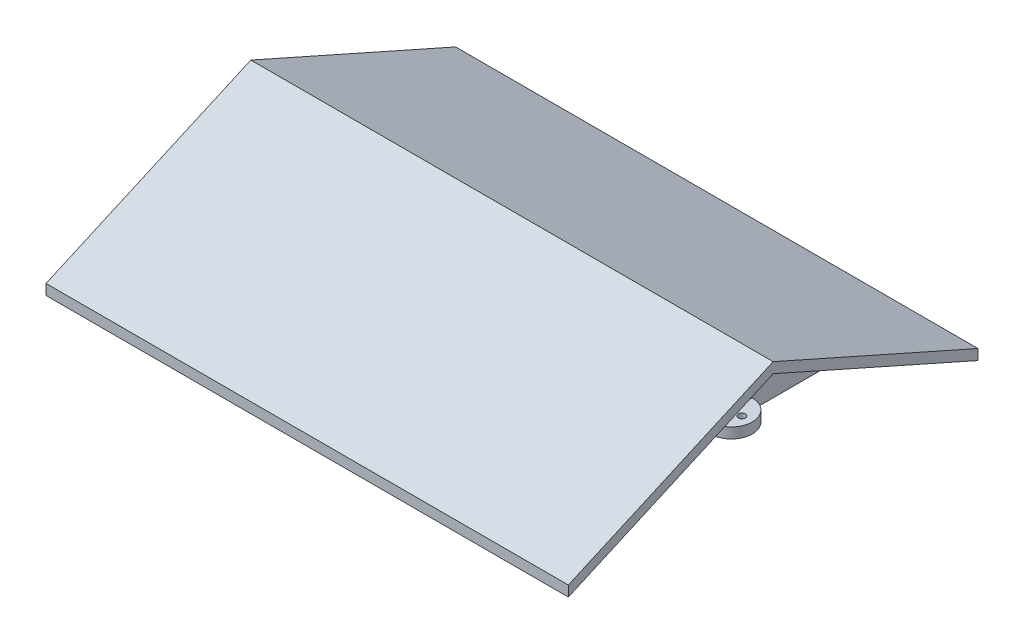
ISO-10303-21;
HEADER;
FILE_DESCRIPTION(('STEP AP214'),'2;1');
FILE_NAME('part.step','',(''),(''),'','','');
FILE_SCHEMA(('AUTOMOTIVE_DESIGN { 1 0 10303 214 1 1 1 1 }'));
ENDSEC;
DATA;
#1=APPLICATION_CONTEXT('core data for automotive mechanical design processes');
#2=APPLICATION_PROTOCOL_DEFINITION('international standard','automotive_design',2000,#1);
#3=PRODUCT_CONTEXT('',#1,'mechanical');
#4=PRODUCT('Part','Part','',(#3));
#5=PRODUCT_RELATED_PRODUCT_CATEGORY('part','',(#4));
#6=PRODUCT_DEFINITION_FORMATION('','',#4);
#7=PRODUCT_DEFINITION_CONTEXT('part definition',#1,'design');
#8=PRODUCT_DEFINITION('design','',#6,#7);
#9=PRODUCT_DEFINITION_SHAPE('','',#8);
#10=(LENGTH_UNIT() NAMED_UNIT(*) SI_UNIT(.MILLI.,.METRE.));
#11=(NAMED_UNIT(*) PLANE_ANGLE_UNIT() SI_UNIT($,.RADIAN.));
#12=(NAMED_UNIT(*) SI_UNIT($,.STERADIAN.) SOLID_ANGLE_UNIT());
#13=UNCERTAINTY_MEASURE_WITH_UNIT(LENGTH_MEASURE(1.E-05),#10,'distance_accuracy_value','');
#14=(GEOMETRIC_REPRESENTATION_CONTEXT(3) GLOBAL_UNCERTAINTY_ASSIGNED_CONTEXT((#13)) GLOBAL_UNIT_ASSIGNED_CONTEXT((#10,
#11,#12)) REPRESENTATION_CONTEXT('',''));
#15=CARTESIAN_POINT('',(0.,0.,0.));
#16=DIRECTION('',(0.,0.,1.));
#17=DIRECTION('',(1.,0.,0.));
#18=AXIS2_PLACEMENT_3D('',#15,#16,#17);
#19=CARTESIAN_POINT('',(-250.,4.17575683731504,1.85589192769557));
#20=DIRECTION('',(0.,-0.913811548620257,-0.406138466053448));
#21=DIRECTION('',(0.,0.406138466053448,-0.913811548620257));
#22=AXIS2_PLACEMENT_3D('',#19,#20,#21);
#23=PLANE('',#22);
#24=DIRECTION('',(0.,0.406138466053448,-0.913811548620257));
#25=VECTOR('',#24,1.);
#26=CARTESIAN_POINT('',(0.,4.17575683731504,1.85589192769557));
#27=LINE('',#26,#25);
#28=CARTESIAN_POINT('',(0.,-8.56595570881448,30.524745156487));
#29=VERTEX_POINT('',#28);
#30=CARTESIAN_POINT('',(0.,35.0005976940686,-67.5));
#31=VERTEX_POINT('',#30);
#32=EDGE_CURVE('E256',#29,#31,#27,.T.);
#33=ORIENTED_EDGE('',*,*,#32,.T.);
#34=DIRECTION('',(1.,0.,0.));
#35=VECTOR('',#34,1.);
#36=CARTESIAN_POINT('',(-250.,35.0005976940686,-67.5));
#37=LINE('',#36,#35);
#38=CARTESIAN_POINT('',(-250.,35.0005976940686,-67.5));
#39=VERTEX_POINT('',#38);
#40=EDGE_CURVE('E301',#39,#31,#37,.T.);
#41=ORIENTED_EDGE('',*,*,#40,.F.);
#42=DIRECTION('',(0.,0.406138466053448,-0.913811548620257));
#43=VECTOR('',#42,1.);
#44=CARTESIAN_POINT('',(-250.,4.17575683731504,1.85589192769557));
#45=LINE('',#44,#43);
#46=CARTESIAN_POINT('',(-250.,-8.56595570881448,30.524745156487));
#47=VERTEX_POINT('',#46);
#48=EDGE_CURVE('E260',#47,#39,#45,.T.);
#49=ORIENTED_EDGE('',*,*,#48,.F.);
#50=DIRECTION('',(1.,0.,0.));
#51=VECTOR('',#50,1.);
#52=CARTESIAN_POINT('',(-250.,-8.56595570881448,30.524745156487));
#53=LINE('',#52,#51);
#54=EDGE_CURVE('E281',#47,#29,#53,.T.);
#55=ORIENTED_EDGE('',*,*,#54,.T.);
#56=EDGE_LOOP('',(#33,#41,#49,#55));
#57=FACE_BOUND('',#56,.T.);
#58=ADVANCED_FACE('F47',(#57),#23,.F.);
#59=CARTESIAN_POINT('',(-250.,54.2788496208202,-24.123933164809));
#60=DIRECTION('',(0.,0.913811548620257,-0.406138466053448));
#61=DIRECTION('',(0.,0.406138466053448,0.913811548620257));
#62=AXIS2_PLACEMENT_3D('',#59,#60,#61);
#63=PLANE('',#62);
#64=DIRECTION('',(0.,0.406138466053448,0.913811548620257));
#65=VECTOR('',#64,1.);
#66=CARTESIAN_POINT('',(0.,54.2788496208202,-24.123933164809));
#67=LINE('',#66,#65);
#68=CARTESIAN_POINT('',(0.,-8.56595570881448,-165.524745156487));
#69=VERTEX_POINT('',#68);
#70=EDGE_CURVE('E264',#69,#31,#67,.T.);
#71=ORIENTED_EDGE('',*,*,#70,.F.);
#72=DIRECTION('',(1.,0.,0.));
#73=VECTOR('',#72,1.);
#74=CARTESIAN_POINT('',(-250.,-8.56595570881448,-165.524745156487));
#75=LINE('',#74,#73);
#76=CARTESIAN_POINT('',(-250.,-8.56595570881448,-165.524745156487));
#77=VERTEX_POINT('',#76);
#78=EDGE_CURVE('E305',#77,#69,#75,.T.);
#79=ORIENTED_EDGE('',*,*,#78,.F.);
#80=DIRECTION('',(0.,0.406138466053448,0.913811548620257));
#81=VECTOR('',#80,1.);
#82=CARTESIAN_POINT('',(-250.,54.2788496208202,-24.123933164809));
#83=LINE('',#82,#81);
#84=EDGE_CURVE('E277',#77,#39,#83,.T.);
#85=ORIENTED_EDGE('',*,*,#84,.T.);
#86=ORIENTED_EDGE('',*,*,#40,.T.);
#87=EDGE_LOOP('',(#71,#79,#85,#86));
#88=FACE_BOUND('',#87,.T.);
#89=ADVANCED_FACE('F462',(#88),#63,.T.);
#90=CARTESIAN_POINT('',(-250.,0.,-165.524745156487));
#91=DIRECTION('',(0.,0.,-1.));
#92=DIRECTION('',(-1.,0.,0.));
#93=AXIS2_PLACEMENT_3D('',#90,#91,#92);
#94=PLANE('',#93);
#95=DIRECTION('',(0.,1.,0.));
#96=VECTOR('',#95,1.);
#97=CARTESIAN_POINT('',(0.,0.,-165.524745156487));
#98=LINE('',#97,#96);
#99=CARTESIAN_POINT('',(0.,-13.5665534028831,-165.524745156487));
#100=VERTEX_POINT('',#99);
#101=EDGE_CURVE('E294',#100,#69,#98,.T.);
#102=ORIENTED_EDGE('',*,*,#101,.F.);
#103=DIRECTION('',(1.,0.,0.));
#104=VECTOR('',#103,1.);
#105=CARTESIAN_POINT('',(-250.,-13.5665534028831,-165.524745156487));
#106=LINE('',#105,#104);
#107=CARTESIAN_POINT('',(-250.,-13.5665534028831,-165.524745156487));
#108=VERTEX_POINT('',#107);
#109=EDGE_CURVE('E308',#108,#100,#106,.T.);
#110=ORIENTED_EDGE('',*,*,#109,.F.);
#111=DIRECTION('',(0.,1.,0.));
#112=VECTOR('',#111,1.);
#113=CARTESIAN_POINT('',(-250.,0.,-165.524745156487));
#114=LINE('',#113,#112);
#115=EDGE_CURVE('E273',#108,#77,#114,.T.);
#116=ORIENTED_EDGE('',*,*,#115,.T.);
#117=ORIENTED_EDGE('',*,*,#78,.T.);
#118=EDGE_LOOP('',(#102,#110,#116,#117));
#119=FACE_BOUND('',#118,.T.);
#120=ADVANCED_FACE('F467',(#119),#94,.T.);
#121=CARTESIAN_POINT('',(-250.,50.1030927835052,-22.2680412371134));
#122=DIRECTION('',(0.,-0.913811548620257,0.406138466053448));
#123=DIRECTION('',(0.,-0.406138466053448,-0.913811548620257));
#124=AXIS2_PLACEMENT_3D('',#121,#122,#123);
#125=PLANE('',#124);
#126=DIRECTION('',(-1.,0.,0.));
#127=VECTOR('',#126,1.);
#128=CARTESIAN_POINT('',(-225.,0.,-135.));
#129=LINE('',#128,#127);
#130=CARTESIAN_POINT('',(-225.,0.,-135.));
#131=VERTEX_POINT('',#130);
#132=CARTESIAN_POINT('',(-230.,0.,-135.));
#133=VERTEX_POINT('',#132);
#134=EDGE_CURVE('E208',#131,#133,#129,.T.);
#135=ORIENTED_EDGE('',*,*,#134,.T.);
#136=DIRECTION('',(0.,-0.406138466053447,-0.913811548620257));
#137=VECTOR('',#136,1.);
#138=CARTESIAN_POINT('',(-230.,30.,-67.5));
#139=LINE('',#138,#137);
#140=CARTESIAN_POINT('',(-230.,30.,-67.5));
#141=VERTEX_POINT('',#140);
#142=EDGE_CURVE('E379',#141,#133,#139,.T.);
#143=ORIENTED_EDGE('',*,*,#142,.F.);
#144=DIRECTION('',(-1.,0.,0.));
#145=VECTOR('',#144,1.);
#146=CARTESIAN_POINT('',(-230.,30.,-67.5));
#147=LINE('',#146,#145);
#148=CARTESIAN_POINT('',(-250.,30.,-67.5));
#149=VERTEX_POINT('',#148);
#150=EDGE_CURVE('E365',#141,#149,#147,.T.);
#151=ORIENTED_EDGE('',*,*,#150,.T.);
#152=DIRECTION('',(0.,-0.406138466053448,-0.913811548620257));
#153=VECTOR('',#152,1.);
#154=CARTESIAN_POINT('',(-250.,50.1030927835052,-22.2680412371134));
#155=LINE('',#154,#153);
#156=EDGE_CURVE('E270',#149,#108,#155,.T.);
#157=ORIENTED_EDGE('',*,*,#156,.T.);
#158=ORIENTED_EDGE('',*,*,#109,.T.);
#159=DIRECTION('',(0.,-0.406138466053448,-0.913811548620257));
#160=VECTOR('',#159,1.);
#161=CARTESIAN_POINT('',(0.,50.1030927835052,-22.2680412371134));
#162=LINE('',#161,#160);
#163=CARTESIAN_POINT('',(0.,30.,-67.5));
#164=VERTEX_POINT('',#163);
#165=EDGE_CURVE('E291',#164,#100,#162,.T.);
#166=ORIENTED_EDGE('',*,*,#165,.F.);
#167=DIRECTION('',(1.,0.,0.));
#168=VECTOR('',#167,1.);
#169=CARTESIAN_POINT('',(-20.,30.,-67.5));
#170=LINE('',#169,#168);
#171=CARTESIAN_POINT('',(-20.,30.,-67.5));
#172=VERTEX_POINT('',#171);
#173=EDGE_CURVE('E234',#172,#164,#170,.T.);
#174=ORIENTED_EDGE('',*,*,#173,.F.);
#175=DIRECTION('',(0.,0.406138466053447,0.913811548620257));
#176=VECTOR('',#175,1.);
#177=CARTESIAN_POINT('',(-20.,0.,-135.));
#178=LINE('',#177,#176);
#179=CARTESIAN_POINT('',(-20.,0.,-135.));
#180=VERTEX_POINT('',#179);
#181=EDGE_CURVE('E230',#180,#172,#178,.T.);
#182=ORIENTED_EDGE('',*,*,#181,.F.);
#183=DIRECTION('',(1.,0.,0.));
#184=VECTOR('',#183,1.);
#185=CARTESIAN_POINT('',(-25.,0.,-135.));
#186=LINE('',#185,#184);
#187=CARTESIAN_POINT('',(-25.,0.,-135.));
#188=VERTEX_POINT('',#187);
#189=EDGE_CURVE('E252',#188,#180,#186,.T.);
#190=ORIENTED_EDGE('',*,*,#189,.F.);
#191=DIRECTION('',(0.,0.406138466053448,0.913811548620257));
#192=VECTOR('',#191,1.);
#193=CARTESIAN_POINT('',(-25.,0.,-135.));
#194=LINE('',#193,#192);
#195=CARTESIAN_POINT('',(-25.,30.,-67.5));
#196=VERTEX_POINT('',#195);
#197=EDGE_CURVE('E247',#188,#196,#194,.T.);
#198=ORIENTED_EDGE('',*,*,#197,.T.);
#199=DIRECTION('',(1.,0.,0.));
#200=VECTOR('',#199,1.);
#201=CARTESIAN_POINT('',(-250.,30.,-67.5));
#202=LINE('',#201,#200);
#203=CARTESIAN_POINT('',(-225.,30.,-67.5));
#204=VERTEX_POINT('',#203);
#205=EDGE_CURVE('E312',#204,#196,#202,.T.);
#206=ORIENTED_EDGE('',*,*,#205,.F.);
#207=DIRECTION('',(0.,-0.406138466053448,-0.913811548620257));
#208=VECTOR('',#207,1.);
#209=CARTESIAN_POINT('',(-225.,0.,-135.));
#210=LINE('',#209,#208);
#211=EDGE_CURVE('E216',#204,#131,#210,.T.);
#212=ORIENTED_EDGE('',*,*,#211,.T.);
#213=EDGE_LOOP('',(#135,#143,#151,#157,#158,#166,#174,#182,#190,#198,#206,#212));
#214=FACE_BOUND('',#213,.T.);
#215=ADVANCED_FACE('F346',(#214),#125,.T.);
#216=CARTESIAN_POINT('',(-250.,0.,0.));
#217=DIRECTION('',(0.,0.913811548620257,0.406138466053447));
#218=DIRECTION('',(0.,-0.406138466053447,0.913811548620257));
#219=AXIS2_PLACEMENT_3D('',#216,#217,#218);
#220=PLANE('',#219);
#221=DIRECTION('',(0.,-0.406138466053447,0.913811548620257));
#222=VECTOR('',#221,1.);
#223=CARTESIAN_POINT('',(-250.,0.,0.));
#224=LINE('',#223,#222);
#225=CARTESIAN_POINT('',(-250.,-13.5665534028831,30.524745156487));
#226=VERTEX_POINT('',#225);
#227=EDGE_CURVE('E267',#149,#226,#224,.T.);
#228=ORIENTED_EDGE('',*,*,#227,.F.);
#229=ORIENTED_EDGE('',*,*,#150,.F.);
#230=DIRECTION('',(0.,0.406138466053447,-0.913811548620257));
#231=VECTOR('',#230,1.);
#232=CARTESIAN_POINT('',(-230.,0.,0.));
#233=LINE('',#232,#231);
#234=CARTESIAN_POINT('',(-230.,0.,0.));
#235=VERTEX_POINT('',#234);
#236=EDGE_CURVE('E369',#235,#141,#233,.T.);
#237=ORIENTED_EDGE('',*,*,#236,.F.);
#238=DIRECTION('',(-1.,0.,0.));
#239=VECTOR('',#238,1.);
#240=CARTESIAN_POINT('',(-225.,0.,0.));
#241=LINE('',#240,#239);
#242=CARTESIAN_POINT('',(-225.,0.,0.));
#243=VERTEX_POINT('',#242);
#244=EDGE_CURVE('E214',#243,#235,#241,.T.);
#245=ORIENTED_EDGE('',*,*,#244,.F.);
#246=DIRECTION('',(0.,0.406138466053448,-0.913811548620257));
#247=VECTOR('',#246,1.);
#248=CARTESIAN_POINT('',(-225.,30.,-67.5));
#249=LINE('',#248,#247);
#250=EDGE_CURVE('E362',#243,#204,#249,.T.);
#251=ORIENTED_EDGE('',*,*,#250,.T.);
#252=ORIENTED_EDGE('',*,*,#205,.T.);
#253=DIRECTION('',(0.,-0.406138466053448,0.913811548620257));
#254=VECTOR('',#253,1.);
#255=CARTESIAN_POINT('',(-25.,30.,-67.5));
#256=LINE('',#255,#254);
#257=CARTESIAN_POINT('',(-25.,0.,0.));
#258=VERTEX_POINT('',#257);
#259=EDGE_CURVE('E238',#196,#258,#256,.T.);
#260=ORIENTED_EDGE('',*,*,#259,.T.);
#261=DIRECTION('',(1.,0.,0.));
#262=VECTOR('',#261,1.);
#263=CARTESIAN_POINT('',(-25.,0.,0.));
#264=LINE('',#263,#262);
#265=CARTESIAN_POINT('',(-20.,0.,0.));
#266=VERTEX_POINT('',#265);
#267=EDGE_CURVE('E251',#258,#266,#264,.T.);
#268=ORIENTED_EDGE('',*,*,#267,.T.);
#269=DIRECTION('',(0.,-0.406138466053447,0.913811548620257));
#270=VECTOR('',#269,1.);
#271=CARTESIAN_POINT('',(-20.,30.,-67.5));
#272=LINE('',#271,#270);
#273=EDGE_CURVE('E222',#172,#266,#272,.T.);
#274=ORIENTED_EDGE('',*,*,#273,.F.);
#275=ORIENTED_EDGE('',*,*,#173,.T.);
#276=DIRECTION('',(0.,-0.406138466053447,0.913811548620257));
#277=VECTOR('',#276,1.);
#278=CARTESIAN_POINT('',(0.,0.,0.));
#279=LINE('',#278,#277);
#280=CARTESIAN_POINT('',(0.,-13.5665534028831,30.524745156487));
#281=VERTEX_POINT('',#280);
#282=EDGE_CURVE('E288',#164,#281,#279,.T.);
#283=ORIENTED_EDGE('',*,*,#282,.T.);
#284=DIRECTION('',(1.,0.,0.));
#285=VECTOR('',#284,1.);
#286=CARTESIAN_POINT('',(-250.,-13.5665534028831,30.524745156487));
#287=LINE('',#286,#285);
#288=EDGE_CURVE('E315',#226,#281,#287,.T.);
#289=ORIENTED_EDGE('',*,*,#288,.F.);
#290=EDGE_LOOP('',(#228,#229,#237,#245,#251,#252,#260,#268,#274,#275,#283,#289));
#291=FACE_BOUND('',#290,.T.);
#292=ADVANCED_FACE('F430',(#291),#220,.F.);
#293=CARTESIAN_POINT('',(-250.,0.,30.524745156487));
#294=DIRECTION('',(0.,0.,-1.));
#295=DIRECTION('',(-1.,0.,0.));
#296=AXIS2_PLACEMENT_3D('',#293,#294,#295);
#297=PLANE('',#296);
#298=DIRECTION('',(0.,1.,0.));
#299=VECTOR('',#298,1.);
#300=CARTESIAN_POINT('',(0.,0.,30.524745156487));
#301=LINE('',#300,#299);
#302=EDGE_CURVE('E285',#281,#29,#301,.T.);
#303=ORIENTED_EDGE('',*,*,#302,.T.);
#304=ORIENTED_EDGE('',*,*,#54,.F.);
#305=DIRECTION('',(0.,1.,0.));
#306=VECTOR('',#305,1.);
#307=CARTESIAN_POINT('',(-250.,0.,30.524745156487));
#308=LINE('',#307,#306);
#309=EDGE_CURVE('E263',#226,#47,#308,.T.);
#310=ORIENTED_EDGE('',*,*,#309,.F.);
#311=ORIENTED_EDGE('',*,*,#288,.T.);
#312=EDGE_LOOP('',(#303,#304,#310,#311));
#313=FACE_BOUND('',#312,.T.);
#314=ADVANCED_FACE('F486',(#313),#297,.F.);
#315=CARTESIAN_POINT('',(-250.,0.,0.));
#316=DIRECTION('',(1.,0.,0.));
#317=DIRECTION('',(0.,0.,-1.));
#318=AXIS2_PLACEMENT_3D('',#315,#316,#317);
#319=PLANE('',#318);
#320=ORIENTED_EDGE('',*,*,#156,.F.);
#321=ORIENTED_EDGE('',*,*,#227,.T.);
#322=ORIENTED_EDGE('',*,*,#309,.T.);
#323=ORIENTED_EDGE('',*,*,#48,.T.);
#324=ORIENTED_EDGE('',*,*,#84,.F.);
#325=ORIENTED_EDGE('',*,*,#115,.F.);
#326=EDGE_LOOP('',(#320,#321,#322,#323,#324,#325));
#327=FACE_BOUND('',#326,.T.);
#328=ADVANCED_FACE('F482',(#327),#319,.F.);
#329=CARTESIAN_POINT('',(0.,0.,0.));
#330=DIRECTION('',(1.,0.,0.));
#331=DIRECTION('',(0.,0.,-1.));
#332=AXIS2_PLACEMENT_3D('',#329,#330,#331);
#333=PLANE('',#332);
#334=ORIENTED_EDGE('',*,*,#282,.F.);
#335=ORIENTED_EDGE('',*,*,#165,.T.);
#336=ORIENTED_EDGE('',*,*,#101,.T.);
#337=ORIENTED_EDGE('',*,*,#70,.T.);
#338=ORIENTED_EDGE('',*,*,#32,.F.);
#339=ORIENTED_EDGE('',*,*,#302,.F.);
#340=EDGE_LOOP('',(#334,#335,#336,#337,#338,#339));
#341=FACE_BOUND('',#340,.T.);
#342=ADVANCED_FACE('F477',(#341),#333,.T.);
#343=CARTESIAN_POINT('',(-25.,0.,0.));
#344=DIRECTION('',(0.,-1.,0.));
#345=DIRECTION('',(0.,0.,-1.));
#346=AXIS2_PLACEMENT_3D('',#343,#344,#345);
#347=PLANE('',#346);
#348=DIRECTION('',(0.,0.,-1.));
#349=VECTOR('',#348,1.);
#350=CARTESIAN_POINT('',(-20.,0.,0.));
#351=LINE('',#350,#349);
#352=CARTESIAN_POINT('',(-20.,0.,-77.5));
#353=VERTEX_POINT('',#352);
#354=EDGE_CURVE('E226',#353,#180,#351,.T.);
#355=ORIENTED_EDGE('',*,*,#354,.F.);
#356=CARTESIAN_POINT('',(-20.,0.,-67.5));
#357=DIRECTION('',(0.,-1.,0.));
#358=DIRECTION('',(0.,0.,-1.));
#359=AXIS2_PLACEMENT_3D('',#356,#357,#358);
#360=CIRCLE('',#359,10.);
#361=CARTESIAN_POINT('',(-20.,0.,-57.5));
#362=VERTEX_POINT('',#361);
#363=EDGE_CURVE('E398',#353,#362,#360,.T.);
#364=ORIENTED_EDGE('',*,*,#363,.T.);
#365=EDGE_CURVE('E227',#266,#362,#351,.T.);
#366=ORIENTED_EDGE('',*,*,#365,.F.);
#367=ORIENTED_EDGE('',*,*,#267,.F.);
#368=DIRECTION('',(0.,0.,-1.));
#369=VECTOR('',#368,1.);
#370=CARTESIAN_POINT('',(-25.,0.,0.));
#371=LINE('',#370,#369);
#372=CARTESIAN_POINT('',(-25.,0.,-58.8397459621556));
#373=VERTEX_POINT('',#372);
#374=EDGE_CURVE('E243',#258,#373,#371,.T.);
#375=ORIENTED_EDGE('',*,*,#374,.T.);
#376=CARTESIAN_POINT('',(-25.,0.,-76.1602540378444));
#377=VERTEX_POINT('',#376);
#378=EDGE_CURVE('E201',#373,#377,#360,.T.);
#379=ORIENTED_EDGE('',*,*,#378,.T.);
#380=EDGE_CURVE('E242',#377,#188,#371,.T.);
#381=ORIENTED_EDGE('',*,*,#380,.T.);
#382=ORIENTED_EDGE('',*,*,#189,.T.);
#383=EDGE_LOOP('',(#355,#364,#366,#367,#375,#379,#381,#382));
#384=FACE_BOUND('',#383,.T.);
#385=CARTESIAN_POINT('',(-15.,0.,-67.5));
#386=DIRECTION('',(0.,-1.,0.));
#387=DIRECTION('',(0.,0.,-1.));
#388=AXIS2_PLACEMENT_3D('',#385,#386,#387);
#389=CIRCLE('',#388,1.7);
#390=CARTESIAN_POINT('',(-15.,0.,-69.2));
#391=VERTEX_POINT('',#390);
#392=EDGE_CURVE('E393',#391,#391,#389,.T.);
#393=ORIENTED_EDGE('',*,*,#392,.F.);
#394=EDGE_LOOP('',(#393));
#395=FACE_BOUND('',#394,.T.);
#396=ADVANCED_FACE('F349',(#384,#395),#347,.T.);
#397=CARTESIAN_POINT('',(-25.,0.,0.));
#398=DIRECTION('',(-1.,0.,0.));
#399=DIRECTION('',(0.,0.,1.));
#400=AXIS2_PLACEMENT_3D('',#397,#398,#399);
#401=PLANE('',#400);
#402=DIRECTION('',(0.,-1.,0.));
#403=VECTOR('',#402,1.);
#404=CARTESIAN_POINT('',(-25.,5.,-76.1602540378444));
#405=LINE('',#404,#403);
#406=CARTESIAN_POINT('',(-25.,5.,-76.1602540378444));
#407=VERTEX_POINT('',#406);
#408=EDGE_CURVE('E382',#407,#377,#405,.T.);
#409=ORIENTED_EDGE('',*,*,#408,.F.);
#410=DIRECTION('',(0.,0.,1.));
#411=VECTOR('',#410,1.);
#412=CARTESIAN_POINT('',(-25.,5.,0.));
#413=LINE('',#412,#411);
#414=CARTESIAN_POINT('',(-25.,5.,-58.8397459621556));
#415=VERTEX_POINT('',#414);
#416=EDGE_CURVE('E388',#407,#415,#413,.T.);
#417=ORIENTED_EDGE('',*,*,#416,.T.);
#418=DIRECTION('',(0.,-1.,0.));
#419=VECTOR('',#418,1.);
#420=CARTESIAN_POINT('',(-25.,5.,-58.8397459621556));
#421=LINE('',#420,#419);
#422=EDGE_CURVE('E385',#373,#415,#421,.F.);
#423=ORIENTED_EDGE('',*,*,#422,.F.);
#424=ORIENTED_EDGE('',*,*,#374,.F.);
#425=ORIENTED_EDGE('',*,*,#259,.F.);
#426=ORIENTED_EDGE('',*,*,#197,.F.);
#427=ORIENTED_EDGE('',*,*,#380,.F.);
#428=EDGE_LOOP('',(#409,#417,#423,#424,#425,#426,#427));
#429=FACE_BOUND('',#428,.T.);
#430=ADVANCED_FACE('F357',(#429),#401,.T.);
#431=CARTESIAN_POINT('',(-20.,0.,0.));
#432=DIRECTION('',(-1.,0.,0.));
#433=DIRECTION('',(0.,0.,1.));
#434=AXIS2_PLACEMENT_3D('',#431,#432,#433);
#435=PLANE('',#434);
#436=DIRECTION('',(0.,0.,1.));
#437=VECTOR('',#436,1.);
#438=CARTESIAN_POINT('',(-20.,5.,0.));
#439=LINE('',#438,#437);
#440=CARTESIAN_POINT('',(-20.,5.,-77.5));
#441=VERTEX_POINT('',#440);
#442=CARTESIAN_POINT('',(-20.,5.,-57.5));
#443=VERTEX_POINT('',#442);
#444=EDGE_CURVE('E304',#441,#443,#439,.T.);
#445=ORIENTED_EDGE('',*,*,#444,.F.);
#446=DIRECTION('',(0.,-1.,0.));
#447=VECTOR('',#446,1.);
#448=CARTESIAN_POINT('',(-20.,5.,-77.5));
#449=LINE('',#448,#447);
#450=EDGE_CURVE('E328',#441,#353,#449,.T.);
#451=ORIENTED_EDGE('',*,*,#450,.T.);
#452=ORIENTED_EDGE('',*,*,#354,.T.);
#453=ORIENTED_EDGE('',*,*,#181,.T.);
#454=ORIENTED_EDGE('',*,*,#273,.T.);
#455=ORIENTED_EDGE('',*,*,#365,.T.);
#456=DIRECTION('',(0.,-1.,0.));
#457=VECTOR('',#456,1.);
#458=CARTESIAN_POINT('',(-20.,5.,-57.5));
#459=LINE('',#458,#457);
#460=EDGE_CURVE('E325',#362,#443,#459,.F.);
#461=ORIENTED_EDGE('',*,*,#460,.T.);
#462=EDGE_LOOP('',(#445,#451,#452,#453,#454,#455,#461));
#463=FACE_BOUND('',#462,.T.);
#464=ADVANCED_FACE('F339',(#463),#435,.F.);
#465=CARTESIAN_POINT('',(-225.,0.,0.));
#466=DIRECTION('',(0.,-1.,0.));
#467=DIRECTION('',(0.,0.,-1.));
#468=AXIS2_PLACEMENT_3D('',#465,#466,#467);
#469=PLANE('',#468);
#470=DIRECTION('',(0.,0.,1.));
#471=VECTOR('',#470,1.);
#472=CARTESIAN_POINT('',(-230.,0.,-135.));
#473=LINE('',#472,#471);
#474=CARTESIAN_POINT('',(-230.,0.,-57.5));
#475=VERTEX_POINT('',#474);
#476=EDGE_CURVE('E378',#475,#235,#473,.T.);
#477=ORIENTED_EDGE('',*,*,#476,.F.);
#478=CARTESIAN_POINT('',(-230.,0.,-67.5));
#479=DIRECTION('',(0.,-1.,0.));
#480=DIRECTION('',(0.,0.,-1.));
#481=AXIS2_PLACEMENT_3D('',#478,#479,#480);
#482=CIRCLE('',#481,10.);
#483=CARTESIAN_POINT('',(-230.,0.,-77.5));
#484=VERTEX_POINT('',#483);
#485=EDGE_CURVE('E191',#475,#484,#482,.T.);
#486=ORIENTED_EDGE('',*,*,#485,.T.);
#487=EDGE_CURVE('E375',#133,#484,#473,.T.);
#488=ORIENTED_EDGE('',*,*,#487,.F.);
#489=ORIENTED_EDGE('',*,*,#134,.F.);
#490=DIRECTION('',(0.,0.,1.));
#491=VECTOR('',#490,1.);
#492=CARTESIAN_POINT('',(-225.,0.,0.));
#493=LINE('',#492,#491);
#494=CARTESIAN_POINT('',(-225.,0.,-76.1602540378444));
#495=VERTEX_POINT('',#494);
#496=EDGE_CURVE('E198',#131,#495,#493,.T.);
#497=ORIENTED_EDGE('',*,*,#496,.T.);
#498=CARTESIAN_POINT('',(-225.,0.,-58.8397459621556));
#499=VERTEX_POINT('',#498);
#500=EDGE_CURVE('E62',#495,#499,#482,.T.);
#501=ORIENTED_EDGE('',*,*,#500,.T.);
#502=EDGE_CURVE('E210',#499,#243,#493,.T.);
#503=ORIENTED_EDGE('',*,*,#502,.T.);
#504=ORIENTED_EDGE('',*,*,#244,.T.);
#505=EDGE_LOOP('',(#477,#486,#488,#489,#497,#501,#503,#504));
#506=FACE_BOUND('',#505,.T.);
#507=CARTESIAN_POINT('',(-235.,0.,-67.5));
#508=DIRECTION('',(0.,-1.,0.));
#509=DIRECTION('',(0.,0.,-1.));
#510=AXIS2_PLACEMENT_3D('',#507,#508,#509);
#511=CIRCLE('',#510,1.70000000000001);
#512=CARTESIAN_POINT('',(-235.,0.,-69.2));
#513=VERTEX_POINT('',#512);
#514=EDGE_CURVE('E412',#513,#513,#511,.T.);
#515=ORIENTED_EDGE('',*,*,#514,.F.);
#516=EDGE_LOOP('',(#515));
#517=FACE_BOUND('',#516,.T.);
#518=ADVANCED_FACE('F204',(#506,#517),#469,.T.);
#519=CARTESIAN_POINT('',(-225.,0.,0.));
#520=DIRECTION('',(-1.,0.,0.));
#521=DIRECTION('',(0.,0.,1.));
#522=AXIS2_PLACEMENT_3D('',#519,#520,#521);
#523=PLANE('',#522);
#524=DIRECTION('',(0.,0.,1.));
#525=VECTOR('',#524,1.);
#526=CARTESIAN_POINT('',(-225.,5.,0.));
#527=LINE('',#526,#525);
#528=CARTESIAN_POINT('',(-225.,5.,-76.1602540378444));
#529=VERTEX_POINT('',#528);
#530=CARTESIAN_POINT('',(-225.,5.,-58.8397459621556));
#531=VERTEX_POINT('',#530);
#532=EDGE_CURVE('E199',#529,#531,#527,.T.);
#533=ORIENTED_EDGE('',*,*,#532,.F.);
#534=DIRECTION('',(0.,-1.,0.));
#535=VECTOR('',#534,1.);
#536=CARTESIAN_POINT('',(-225.,5.,-76.1602540378444));
#537=LINE('',#536,#535);
#538=EDGE_CURVE('E184',#529,#495,#537,.T.);
#539=ORIENTED_EDGE('',*,*,#538,.T.);
#540=ORIENTED_EDGE('',*,*,#496,.F.);
#541=ORIENTED_EDGE('',*,*,#211,.F.);
#542=ORIENTED_EDGE('',*,*,#250,.F.);
#543=ORIENTED_EDGE('',*,*,#502,.F.);
#544=DIRECTION('',(0.,-1.,0.));
#545=VECTOR('',#544,1.);
#546=CARTESIAN_POINT('',(-225.,5.,-58.8397459621556));
#547=LINE('',#546,#545);
#548=EDGE_CURVE('E187',#499,#531,#547,.F.);
#549=ORIENTED_EDGE('',*,*,#548,.T.);
#550=EDGE_LOOP('',(#533,#539,#540,#541,#542,#543,#549));
#551=FACE_BOUND('',#550,.T.);
#552=ADVANCED_FACE('F196',(#551),#523,.F.);
#553=CARTESIAN_POINT('',(-230.,0.,0.));
#554=DIRECTION('',(1.,0.,0.));
#555=DIRECTION('',(0.,0.,-1.));
#556=AXIS2_PLACEMENT_3D('',#553,#554,#555);
#557=PLANE('',#556);
#558=DIRECTION('',(0.,0.,-1.));
#559=VECTOR('',#558,1.);
#560=CARTESIAN_POINT('',(-230.,5.,0.));
#561=LINE('',#560,#559);
#562=CARTESIAN_POINT('',(-230.,5.,-57.5));
#563=VERTEX_POINT('',#562);
#564=CARTESIAN_POINT('',(-230.,5.,-77.5));
#565=VERTEX_POINT('',#564);
#566=EDGE_CURVE('E332',#563,#565,#561,.T.);
#567=ORIENTED_EDGE('',*,*,#566,.F.);
#568=DIRECTION('',(0.,-1.,0.));
#569=VECTOR('',#568,1.);
#570=CARTESIAN_POINT('',(-230.,5.,-57.5));
#571=LINE('',#570,#569);
#572=EDGE_CURVE('E12',#563,#475,#571,.T.);
#573=ORIENTED_EDGE('',*,*,#572,.T.);
#574=ORIENTED_EDGE('',*,*,#476,.T.);
#575=ORIENTED_EDGE('',*,*,#236,.T.);
#576=ORIENTED_EDGE('',*,*,#142,.T.);
#577=ORIENTED_EDGE('',*,*,#487,.T.);
#578=DIRECTION('',(0.,-1.,0.));
#579=VECTOR('',#578,1.);
#580=CARTESIAN_POINT('',(-230.,5.,-77.5));
#581=LINE('',#580,#579);
#582=EDGE_CURVE('E55',#484,#565,#581,.F.);
#583=ORIENTED_EDGE('',*,*,#582,.T.);
#584=EDGE_LOOP('',(#567,#573,#574,#575,#576,#577,#583));
#585=FACE_BOUND('',#584,.T.);
#586=ADVANCED_FACE('F432',(#585),#557,.F.);
#587=CARTESIAN_POINT('',(-15.,5.,-67.5));
#588=DIRECTION('',(0.,-1.,0.));
#589=DIRECTION('',(0.,0.,-1.));
#590=AXIS2_PLACEMENT_3D('',#587,#588,#589);
#591=CYLINDRICAL_SURFACE('',#590,1.7);
#592=CARTESIAN_POINT('',(-15.,5.,-67.5));
#593=DIRECTION('',(0.,-1.,0.));
#594=DIRECTION('',(0.,0.,-1.));
#595=AXIS2_PLACEMENT_3D('',#592,#593,#594);
#596=CIRCLE('',#595,1.7);
#597=CARTESIAN_POINT('',(-15.,5.,-69.2));
#598=VERTEX_POINT('',#597);
#599=EDGE_CURVE('E392',#598,#598,#596,.T.);
#600=ORIENTED_EDGE('',*,*,#599,.F.);
#601=EDGE_LOOP('',(#600));
#602=FACE_BOUND('',#601,.T.);
#603=ORIENTED_EDGE('',*,*,#392,.T.);
#604=EDGE_LOOP('',(#603));
#605=FACE_BOUND('',#604,.T.);
#606=ADVANCED_FACE('F459',(#602,#605),#591,.F.);
#607=CARTESIAN_POINT('',(0.,5.,0.));
#608=DIRECTION('',(0.,-1.,0.));
#609=DIRECTION('',(0.,0.,-1.));
#610=AXIS2_PLACEMENT_3D('',#607,#608,#609);
#611=PLANE('',#610);
#612=ORIENTED_EDGE('',*,*,#599,.T.);
#613=EDGE_LOOP('',(#612));
#614=FACE_BOUND('',#613,.T.);
#615=CARTESIAN_POINT('',(-20.,5.,-67.5));
#616=DIRECTION('',(0.,-1.,0.));
#617=DIRECTION('',(0.,0.,-1.));
#618=AXIS2_PLACEMENT_3D('',#615,#616,#617);
#619=CIRCLE('',#618,10.);
#620=EDGE_CURVE('E404',#441,#443,#619,.T.);
#621=ORIENTED_EDGE('',*,*,#620,.F.);
#622=ORIENTED_EDGE('',*,*,#444,.T.);
#623=EDGE_LOOP('',(#621,#622));
#624=FACE_BOUND('',#623,.T.);
#625=ADVANCED_FACE('F447',(#614,#624),#611,.F.);
#626=CARTESIAN_POINT('',(-20.,5.,-67.5));
#627=DIRECTION('',(0.,-1.,0.));
#628=DIRECTION('',(0.,0.,-1.));
#629=AXIS2_PLACEMENT_3D('',#626,#627,#628);
#630=CYLINDRICAL_SURFACE('',#629,10.);
#631=ORIENTED_EDGE('',*,*,#450,.F.);
#632=ORIENTED_EDGE('',*,*,#620,.T.);
#633=ORIENTED_EDGE('',*,*,#460,.F.);
#634=ORIENTED_EDGE('',*,*,#363,.F.);
#635=EDGE_LOOP('',(#631,#632,#633,#634));
#636=FACE_BOUND('',#635,.T.);
#637=ADVANCED_FACE('F455',(#636),#630,.T.);
#638=EDGE_CURVE('E397',#415,#407,#619,.T.);
#639=ORIENTED_EDGE('',*,*,#638,.T.);
#640=ORIENTED_EDGE('',*,*,#408,.T.);
#641=ORIENTED_EDGE('',*,*,#378,.F.);
#642=ORIENTED_EDGE('',*,*,#422,.T.);
#643=EDGE_LOOP('',(#639,#640,#641,#642));
#644=FACE_BOUND('',#643,.T.);
#645=ADVANCED_FACE('F440',(#644),#630,.T.);
#646=ORIENTED_EDGE('',*,*,#416,.F.);
#647=ORIENTED_EDGE('',*,*,#638,.F.);
#648=EDGE_LOOP('',(#646,#647));
#649=FACE_BOUND('',#648,.T.);
#650=ADVANCED_FACE('F443',(#649),#611,.F.);
#651=CARTESIAN_POINT('',(-235.,5.,-67.5));
#652=DIRECTION('',(0.,-1.,0.));
#653=DIRECTION('',(0.,0.,-1.));
#654=AXIS2_PLACEMENT_3D('',#651,#652,#653);
#655=CYLINDRICAL_SURFACE('',#654,1.70000000000001);
#656=CARTESIAN_POINT('',(-235.,5.,-67.5));
#657=DIRECTION('',(0.,-1.,0.));
#658=DIRECTION('',(0.,0.,-1.));
#659=AXIS2_PLACEMENT_3D('',#656,#657,#658);
#660=CIRCLE('',#659,1.70000000000001);
#661=CARTESIAN_POINT('',(-235.,5.,-69.2));
#662=VERTEX_POINT('',#661);
#663=EDGE_CURVE('E190',#662,#662,#660,.T.);
#664=ORIENTED_EDGE('',*,*,#663,.F.);
#665=EDGE_LOOP('',(#664));
#666=FACE_BOUND('',#665,.T.);
#667=ORIENTED_EDGE('',*,*,#514,.T.);
#668=EDGE_LOOP('',(#667));
#669=FACE_BOUND('',#668,.T.);
#670=ADVANCED_FACE('F445',(#666,#669),#655,.F.);
#671=CARTESIAN_POINT('',(-230.,5.,-67.5));
#672=DIRECTION('',(0.,-1.,0.));
#673=DIRECTION('',(0.,0.,-1.));
#674=AXIS2_PLACEMENT_3D('',#671,#672,#673);
#675=PLANE('',#674);
#676=ORIENTED_EDGE('',*,*,#663,.T.);
#677=EDGE_LOOP('',(#676));
#678=FACE_BOUND('',#677,.T.);
#679=CARTESIAN_POINT('',(-230.,5.,-67.5));
#680=DIRECTION('',(0.,-1.,0.));
#681=DIRECTION('',(0.,0.,-1.));
#682=AXIS2_PLACEMENT_3D('',#679,#680,#681);
#683=CIRCLE('',#682,10.);
#684=EDGE_CURVE('E419',#563,#565,#683,.T.);
#685=ORIENTED_EDGE('',*,*,#684,.F.);
#686=ORIENTED_EDGE('',*,*,#566,.T.);
#687=EDGE_LOOP('',(#685,#686));
#688=FACE_BOUND('',#687,.T.);
#689=ADVANCED_FACE('F452',(#678,#688),#675,.F.);
#690=CARTESIAN_POINT('',(-230.,5.,-67.5));
#691=DIRECTION('',(0.,-1.,0.));
#692=DIRECTION('',(0.,0.,-1.));
#693=AXIS2_PLACEMENT_3D('',#690,#691,#692);
#694=CYLINDRICAL_SURFACE('',#693,10.);
#695=ORIENTED_EDGE('',*,*,#572,.F.);
#696=ORIENTED_EDGE('',*,*,#684,.T.);
#697=ORIENTED_EDGE('',*,*,#582,.F.);
#698=ORIENTED_EDGE('',*,*,#485,.F.);
#699=EDGE_LOOP('',(#695,#696,#697,#698));
#700=FACE_BOUND('',#699,.T.);
#701=ADVANCED_FACE('F597',(#700),#694,.T.);
#702=ORIENTED_EDGE('',*,*,#538,.F.);
#703=EDGE_CURVE('E422',#529,#531,#683,.T.);
#704=ORIENTED_EDGE('',*,*,#703,.T.);
#705=ORIENTED_EDGE('',*,*,#548,.F.);
#706=ORIENTED_EDGE('',*,*,#500,.F.);
#707=EDGE_LOOP('',(#702,#704,#705,#706));
#708=FACE_BOUND('',#707,.T.);
#709=ADVANCED_FACE('F182',(#708),#694,.T.);
#710=ORIENTED_EDGE('',*,*,#703,.F.);
#711=ORIENTED_EDGE('',*,*,#532,.T.);
#712=EDGE_LOOP('',(#710,#711));
#713=FACE_BOUND('',#712,.T.);
#714=ADVANCED_FACE('F600',(#713),#675,.F.);
#715=CLOSED_SHELL('',(#58,#89,#120,#215,#292,#314,#328,#342,#396,#430,#464,#518,#552,#586,#606,
#625,#637,#645,#650,#670,#689,#701,#709,#714));
#716=MANIFOLD_SOLID_BREP('B2',#715);
#717=ADVANCED_BREP_SHAPE_REPRESENTATION('',(#18,#716),#14);
#718=SHAPE_DEFINITION_REPRESENTATION(#9,#717);
ENDSEC;
END-ISO-10303-21;
